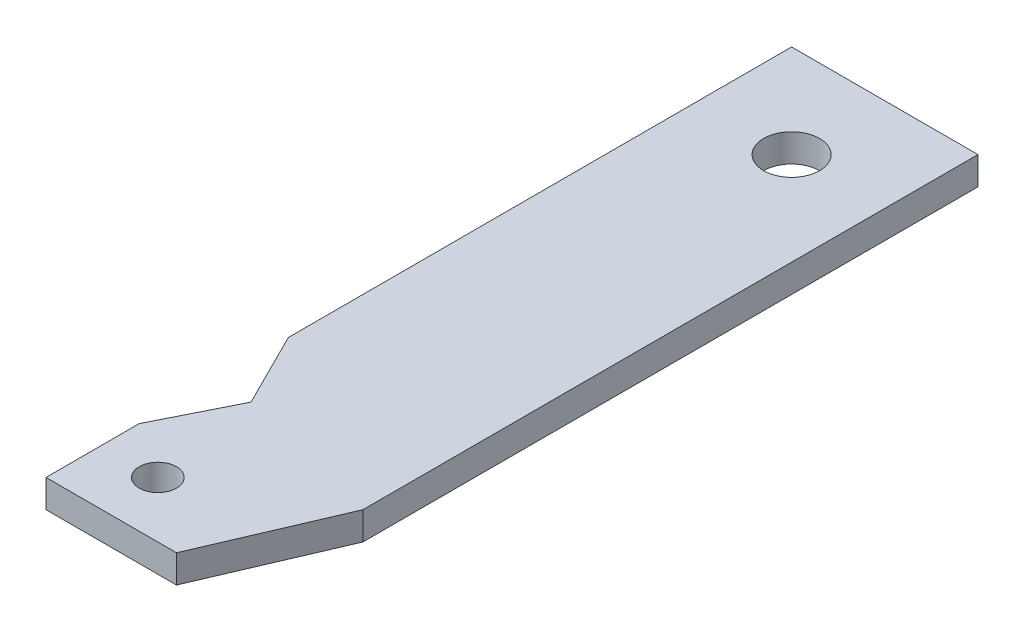
ISO-10303-21;
HEADER;
FILE_DESCRIPTION(('STEP AP214'),'2;1');
FILE_NAME('part.step','',(''),(''),'','','');
FILE_SCHEMA(('AUTOMOTIVE_DESIGN { 1 0 10303 214 1 1 1 1 }'));
ENDSEC;
DATA;
#1=APPLICATION_CONTEXT('core data for automotive mechanical design processes');
#2=APPLICATION_PROTOCOL_DEFINITION('international standard','automotive_design',2000,#1);
#3=PRODUCT_CONTEXT('',#1,'mechanical');
#4=PRODUCT('Part','Part','',(#3));
#5=PRODUCT_RELATED_PRODUCT_CATEGORY('part','',(#4));
#6=PRODUCT_DEFINITION_FORMATION('','',#4);
#7=PRODUCT_DEFINITION_CONTEXT('part definition',#1,'design');
#8=PRODUCT_DEFINITION('design','',#6,#7);
#9=PRODUCT_DEFINITION_SHAPE('','',#8);
#10=(LENGTH_UNIT() NAMED_UNIT(*) SI_UNIT(.MILLI.,.METRE.));
#11=(NAMED_UNIT(*) PLANE_ANGLE_UNIT() SI_UNIT($,.RADIAN.));
#12=(NAMED_UNIT(*) SI_UNIT($,.STERADIAN.) SOLID_ANGLE_UNIT());
#13=UNCERTAINTY_MEASURE_WITH_UNIT(LENGTH_MEASURE(1.E-05),#10,'distance_accuracy_value','');
#14=(GEOMETRIC_REPRESENTATION_CONTEXT(3) GLOBAL_UNCERTAINTY_ASSIGNED_CONTEXT((#13)) GLOBAL_UNIT_ASSIGNED_CONTEXT((#10,
#11,#12)) REPRESENTATION_CONTEXT('',''));
#15=CARTESIAN_POINT('',(0.,0.,0.));
#16=DIRECTION('',(0.,0.,1.));
#17=DIRECTION('',(1.,0.,0.));
#18=AXIS2_PLACEMENT_3D('',#15,#16,#17);
#19=CARTESIAN_POINT('',(-12.7725811166779,11.5904210526316,40.));
#20=DIRECTION('',(1.,0.,0.));
#21=DIRECTION('',(0.,1.,0.));
#22=AXIS2_PLACEMENT_3D('',#19,#20,#21);
#23=PLANE('',#22);
#24=DIRECTION('',(0.,0.,-1.));
#25=VECTOR('',#24,1.);
#26=CARTESIAN_POINT('',(-12.7725811166779,10.0904210526316,40.));
#27=LINE('',#26,#25);
#28=CARTESIAN_POINT('',(-12.7725811166779,10.0904210526316,27.));
#29=VERTEX_POINT('',#28);
#30=CARTESIAN_POINT('',(-12.7725811166779,10.0904210526316,0.));
#31=VERTEX_POINT('',#30);
#32=EDGE_CURVE('E117',#29,#31,#27,.T.);
#33=ORIENTED_EDGE('',*,*,#32,.F.);
#34=DIRECTION('',(0.,1.,0.));
#35=VECTOR('',#34,1.);
#36=CARTESIAN_POINT('',(-12.7725811166779,-38.4095789473684,27.));
#37=LINE('',#36,#35);
#38=CARTESIAN_POINT('',(-12.7725811166779,11.5904210526316,27.));
#39=VERTEX_POINT('',#38);
#40=EDGE_CURVE('E171',#29,#39,#37,.T.);
#41=ORIENTED_EDGE('',*,*,#40,.T.);
#42=DIRECTION('',(0.,0.,-1.));
#43=VECTOR('',#42,1.);
#44=CARTESIAN_POINT('',(-12.7725811166779,11.5904210526316,40.));
#45=LINE('',#44,#43);
#46=CARTESIAN_POINT('',(-12.7725811166779,11.5904210526316,0.));
#47=VERTEX_POINT('',#46);
#48=EDGE_CURVE('E120',#39,#47,#45,.T.);
#49=ORIENTED_EDGE('',*,*,#48,.T.);
#50=DIRECTION('',(0.,-1.,0.));
#51=VECTOR('',#50,1.);
#52=CARTESIAN_POINT('',(-12.7725811166779,11.5904210526316,0.));
#53=LINE('',#52,#51);
#54=EDGE_CURVE('E140',#47,#31,#53,.T.);
#55=ORIENTED_EDGE('',*,*,#54,.T.);
#56=EDGE_LOOP('',(#33,#41,#49,#55));
#57=FACE_BOUND('',#56,.T.);
#58=ADVANCED_FACE('F30',(#57),#23,.F.);
#59=CARTESIAN_POINT('',(-12.7725811166779,11.5904210526316,40.));
#60=VERTEX_POINT('',#59);
#61=CARTESIAN_POINT('',(-12.7725811166779,11.5904210526316,35.));
#62=VERTEX_POINT('',#61);
#63=EDGE_CURVE('E115',#60,#62,#45,.T.);
#64=ORIENTED_EDGE('',*,*,#63,.T.);
#65=DIRECTION('',(0.,1.,0.));
#66=VECTOR('',#65,1.);
#67=CARTESIAN_POINT('',(-12.7725811166779,-38.4095789473684,35.));
#68=LINE('',#67,#66);
#69=CARTESIAN_POINT('',(-12.7725811166779,10.0904210526316,35.));
#70=VERTEX_POINT('',#69);
#71=EDGE_CURVE('E52',#70,#62,#68,.T.);
#72=ORIENTED_EDGE('',*,*,#71,.F.);
#73=CARTESIAN_POINT('',(-12.7725811166779,10.0904210526316,40.));
#74=VERTEX_POINT('',#73);
#75=EDGE_CURVE('E38',#74,#70,#27,.T.);
#76=ORIENTED_EDGE('',*,*,#75,.F.);
#77=DIRECTION('',(0.,-1.,0.));
#78=VECTOR('',#77,1.);
#79=CARTESIAN_POINT('',(-12.7725811166779,11.5904210526316,40.));
#80=LINE('',#79,#78);
#81=EDGE_CURVE('E152',#60,#74,#80,.T.);
#82=ORIENTED_EDGE('',*,*,#81,.F.);
#83=EDGE_LOOP('',(#64,#72,#76,#82));
#84=FACE_BOUND('',#83,.T.);
#85=ADVANCED_FACE('F32',(#84),#23,.F.);
#86=CARTESIAN_POINT('',(-12.7725811166779,10.0904210526316,40.));
#87=DIRECTION('',(0.,1.,0.));
#88=DIRECTION('',(0.,0.,1.));
#89=AXIS2_PLACEMENT_3D('',#86,#87,#88);
#90=PLANE('',#89);
#91=CARTESIAN_POINT('',(-7.77258111667787,10.0904210526316,5.));
#92=DIRECTION('',(0.,1.,0.));
#93=DIRECTION('',(0.,0.,1.));
#94=AXIS2_PLACEMENT_3D('',#91,#92,#93);
#95=CIRCLE('',#94,1.5);
#96=CARTESIAN_POINT('',(-7.77258111667787,10.0904210526316,6.5));
#97=VERTEX_POINT('',#96);
#98=EDGE_CURVE('E162',#97,#97,#95,.T.);
#99=ORIENTED_EDGE('',*,*,#98,.T.);
#100=EDGE_LOOP('',(#99));
#101=FACE_BOUND('',#100,.T.);
#102=CARTESIAN_POINT('',(-9.77258111667787,10.0904210526316,37.));
#103=DIRECTION('',(0.,1.,0.));
#104=DIRECTION('',(0.,0.,1.));
#105=AXIS2_PLACEMENT_3D('',#102,#103,#104);
#106=CIRCLE('',#105,1.);
#107=CARTESIAN_POINT('',(-9.77258111667787,10.0904210526316,38.));
#108=VERTEX_POINT('',#107);
#109=EDGE_CURVE('E143',#108,#108,#106,.T.);
#110=ORIENTED_EDGE('',*,*,#109,.T.);
#111=EDGE_LOOP('',(#110));
#112=FACE_BOUND('',#111,.T.);
#113=DIRECTION('',(0.,0.,-1.));
#114=VECTOR('',#113,1.);
#115=CARTESIAN_POINT('',(-2.77258111667787,10.0904210526316,40.));
#116=LINE('',#115,#114);
#117=CARTESIAN_POINT('',(-2.77258111667787,10.0904210526316,33.));
#118=VERTEX_POINT('',#117);
#119=CARTESIAN_POINT('',(-2.77258111667787,10.0904210526316,0.));
#120=VERTEX_POINT('',#119);
#121=EDGE_CURVE('E114',#118,#120,#116,.T.);
#122=ORIENTED_EDGE('',*,*,#121,.F.);
#123=DIRECTION('',(-0.393919298579168,0.,0.919145030018058));
#124=VECTOR('',#123,1.);
#125=CARTESIAN_POINT('',(-6.85878801322959,10.0904210526316,42.5344827586207));
#126=LINE('',#125,#124);
#127=CARTESIAN_POINT('',(-5.77258111667787,10.0904210526316,40.));
#128=VERTEX_POINT('',#127);
#129=EDGE_CURVE('E96',#118,#128,#126,.T.);
#130=ORIENTED_EDGE('',*,*,#129,.T.);
#131=DIRECTION('',(1.,0.,0.));
#132=VECTOR('',#131,1.);
#133=CARTESIAN_POINT('',(-12.7725811166779,10.0904210526316,40.));
#134=LINE('',#133,#132);
#135=EDGE_CURVE('E154',#74,#128,#134,.T.);
#136=ORIENTED_EDGE('',*,*,#135,.F.);
#137=ORIENTED_EDGE('',*,*,#75,.T.);
#138=DIRECTION('',(0.447213595499958,0.,-0.894427190999916));
#139=VECTOR('',#138,1.);
#140=CARTESIAN_POINT('',(-14.7725811166779,10.0904210526316,39.));
#141=LINE('',#140,#139);
#142=CARTESIAN_POINT('',(-10.7725811166779,10.0904210526316,31.));
#143=VERTEX_POINT('',#142);
#144=EDGE_CURVE('E169',#70,#143,#141,.T.);
#145=ORIENTED_EDGE('',*,*,#144,.T.);
#146=DIRECTION('',(-0.447213595499958,0.,-0.894427190999916));
#147=VECTOR('',#146,1.);
#148=CARTESIAN_POINT('',(-7.57258111667787,10.0904210526316,37.4));
#149=LINE('',#148,#147);
#150=EDGE_CURVE('E133',#143,#29,#149,.T.);
#151=ORIENTED_EDGE('',*,*,#150,.T.);
#152=ORIENTED_EDGE('',*,*,#32,.T.);
#153=DIRECTION('',(1.,0.,0.));
#154=VECTOR('',#153,1.);
#155=CARTESIAN_POINT('',(-12.7725811166779,10.0904210526316,0.));
#156=LINE('',#155,#154);
#157=EDGE_CURVE('E132',#31,#120,#156,.T.);
#158=ORIENTED_EDGE('',*,*,#157,.T.);
#159=EDGE_LOOP('',(#122,#130,#136,#137,#145,#151,#152,#158));
#160=FACE_BOUND('',#159,.T.);
#161=ADVANCED_FACE('F131',(#101,#112,#160),#90,.F.);
#162=CARTESIAN_POINT('',(-2.77258111667787,11.5904210526316,40.));
#163=DIRECTION('',(-1.,0.,0.));
#164=DIRECTION('',(0.,-1.,0.));
#165=AXIS2_PLACEMENT_3D('',#162,#163,#164);
#166=PLANE('',#165);
#167=DIRECTION('',(0.,0.,-1.));
#168=VECTOR('',#167,1.);
#169=CARTESIAN_POINT('',(-2.77258111667787,11.5904210526316,40.));
#170=LINE('',#169,#168);
#171=CARTESIAN_POINT('',(-2.77258111667787,11.5904210526316,33.));
#172=VERTEX_POINT('',#171);
#173=CARTESIAN_POINT('',(-2.77258111667787,11.5904210526316,0.));
#174=VERTEX_POINT('',#173);
#175=EDGE_CURVE('E105',#172,#174,#170,.T.);
#176=ORIENTED_EDGE('',*,*,#175,.F.);
#177=DIRECTION('',(0.,1.,0.));
#178=VECTOR('',#177,1.);
#179=CARTESIAN_POINT('',(-2.77258111667787,-38.4095789473684,33.));
#180=LINE('',#179,#178);
#181=EDGE_CURVE('E93',#118,#172,#180,.T.);
#182=ORIENTED_EDGE('',*,*,#181,.F.);
#183=ORIENTED_EDGE('',*,*,#121,.T.);
#184=DIRECTION('',(0.,1.,0.));
#185=VECTOR('',#184,1.);
#186=CARTESIAN_POINT('',(-2.77258111667787,11.5904210526316,0.));
#187=LINE('',#186,#185);
#188=EDGE_CURVE('E112',#120,#174,#187,.T.);
#189=ORIENTED_EDGE('',*,*,#188,.T.);
#190=EDGE_LOOP('',(#176,#182,#183,#189));
#191=FACE_BOUND('',#190,.T.);
#192=ADVANCED_FACE('F110',(#191),#166,.F.);
#193=CARTESIAN_POINT('',(-12.7725811166779,11.5904210526316,40.));
#194=DIRECTION('',(0.,-1.,0.));
#195=DIRECTION('',(0.,0.,-1.));
#196=AXIS2_PLACEMENT_3D('',#193,#194,#195);
#197=PLANE('',#196);
#198=CARTESIAN_POINT('',(-7.77258111667787,11.5904210526316,5.));
#199=DIRECTION('',(0.,1.,0.));
#200=DIRECTION('',(0.,0.,1.));
#201=AXIS2_PLACEMENT_3D('',#198,#199,#200);
#202=CIRCLE('',#201,1.5);
#203=CARTESIAN_POINT('',(-7.77258111667787,11.5904210526316,6.5));
#204=VERTEX_POINT('',#203);
#205=EDGE_CURVE('E165',#204,#204,#202,.T.);
#206=ORIENTED_EDGE('',*,*,#205,.F.);
#207=EDGE_LOOP('',(#206));
#208=FACE_BOUND('',#207,.T.);
#209=CARTESIAN_POINT('',(-9.77258111667787,11.5904210526316,37.));
#210=DIRECTION('',(0.,1.,0.));
#211=DIRECTION('',(0.,0.,1.));
#212=AXIS2_PLACEMENT_3D('',#209,#210,#211);
#213=CIRCLE('',#212,1.);
#214=CARTESIAN_POINT('',(-9.77258111667787,11.5904210526316,38.));
#215=VERTEX_POINT('',#214);
#216=EDGE_CURVE('E146',#215,#215,#213,.T.);
#217=ORIENTED_EDGE('',*,*,#216,.F.);
#218=EDGE_LOOP('',(#217));
#219=FACE_BOUND('',#218,.T.);
#220=DIRECTION('',(-1.,0.,0.));
#221=VECTOR('',#220,1.);
#222=CARTESIAN_POINT('',(-12.7725811166779,11.5904210526316,40.));
#223=LINE('',#222,#221);
#224=CARTESIAN_POINT('',(-5.77258111667787,11.5904210526316,40.));
#225=VERTEX_POINT('',#224);
#226=EDGE_CURVE('E108',#225,#60,#223,.T.);
#227=ORIENTED_EDGE('',*,*,#226,.F.);
#228=DIRECTION('',(-0.393919298579168,0.,0.919145030018058));
#229=VECTOR('',#228,1.);
#230=CARTESIAN_POINT('',(-2.77258111667787,11.5904210526316,33.));
#231=LINE('',#230,#229);
#232=EDGE_CURVE('E44',#172,#225,#231,.T.);
#233=ORIENTED_EDGE('',*,*,#232,.F.);
#234=ORIENTED_EDGE('',*,*,#175,.T.);
#235=DIRECTION('',(-1.,0.,0.));
#236=VECTOR('',#235,1.);
#237=CARTESIAN_POINT('',(-12.7725811166779,11.5904210526316,0.));
#238=LINE('',#237,#236);
#239=EDGE_CURVE('E151',#174,#47,#238,.T.);
#240=ORIENTED_EDGE('',*,*,#239,.T.);
#241=ORIENTED_EDGE('',*,*,#48,.F.);
#242=DIRECTION('',(-0.447213595499958,0.,-0.894427190999916));
#243=VECTOR('',#242,1.);
#244=CARTESIAN_POINT('',(-10.7725811166779,11.5904210526316,31.));
#245=LINE('',#244,#243);
#246=CARTESIAN_POINT('',(-10.7725811166779,11.5904210526316,31.));
#247=VERTEX_POINT('',#246);
#248=EDGE_CURVE('E174',#247,#39,#245,.T.);
#249=ORIENTED_EDGE('',*,*,#248,.F.);
#250=DIRECTION('',(0.447213595499958,0.,-0.894427190999916));
#251=VECTOR('',#250,1.);
#252=CARTESIAN_POINT('',(-12.7725811166779,11.5904210526316,35.));
#253=LINE('',#252,#251);
#254=EDGE_CURVE('E178',#62,#247,#253,.T.);
#255=ORIENTED_EDGE('',*,*,#254,.F.);
#256=ORIENTED_EDGE('',*,*,#63,.F.);
#257=EDGE_LOOP('',(#227,#233,#234,#240,#241,#249,#255,#256));
#258=FACE_BOUND('',#257,.T.);
#259=ADVANCED_FACE('F103',(#208,#219,#258),#197,.F.);
#260=CARTESIAN_POINT('',(-12.7725811166779,10.0904210526316,40.));
#261=DIRECTION('',(0.,0.,1.));
#262=DIRECTION('',(1.,0.,0.));
#263=AXIS2_PLACEMENT_3D('',#260,#261,#262);
#264=PLANE('',#263);
#265=DIRECTION('',(0.,-1.,0.));
#266=VECTOR('',#265,1.);
#267=CARTESIAN_POINT('',(-5.77258111667787,10.0904210526316,40.));
#268=LINE('',#267,#266);
#269=EDGE_CURVE('E11',#225,#128,#268,.T.);
#270=ORIENTED_EDGE('',*,*,#269,.F.);
#271=ORIENTED_EDGE('',*,*,#226,.T.);
#272=ORIENTED_EDGE('',*,*,#81,.T.);
#273=ORIENTED_EDGE('',*,*,#135,.T.);
#274=EDGE_LOOP('',(#270,#271,#272,#273));
#275=FACE_BOUND('',#274,.T.);
#276=ADVANCED_FACE('F180',(#275),#264,.T.);
#277=CARTESIAN_POINT('',(-12.7725811166779,10.0904210526316,0.));
#278=DIRECTION('',(0.,0.,1.));
#279=DIRECTION('',(1.,0.,0.));
#280=AXIS2_PLACEMENT_3D('',#277,#278,#279);
#281=PLANE('',#280);
#282=ORIENTED_EDGE('',*,*,#54,.F.);
#283=ORIENTED_EDGE('',*,*,#239,.F.);
#284=ORIENTED_EDGE('',*,*,#188,.F.);
#285=ORIENTED_EDGE('',*,*,#157,.F.);
#286=EDGE_LOOP('',(#282,#283,#284,#285));
#287=FACE_BOUND('',#286,.T.);
#288=ADVANCED_FACE('F139',(#287),#281,.F.);
#289=CARTESIAN_POINT('',(-9.77258111667787,-38.4095789473684,37.));
#290=DIRECTION('',(0.,1.,0.));
#291=DIRECTION('',(0.,0.,1.));
#292=AXIS2_PLACEMENT_3D('',#289,#290,#291);
#293=CYLINDRICAL_SURFACE('',#292,1.);
#294=ORIENTED_EDGE('',*,*,#216,.T.);
#295=EDGE_LOOP('',(#294));
#296=FACE_BOUND('',#295,.T.);
#297=ORIENTED_EDGE('',*,*,#109,.F.);
#298=EDGE_LOOP('',(#297));
#299=FACE_BOUND('',#298,.T.);
#300=ADVANCED_FACE('F236',(#296,#299),#293,.F.);
#301=CARTESIAN_POINT('',(-7.77258111667787,-38.4095789473684,5.));
#302=DIRECTION('',(0.,1.,0.));
#303=DIRECTION('',(0.,0.,1.));
#304=AXIS2_PLACEMENT_3D('',#301,#302,#303);
#305=CYLINDRICAL_SURFACE('',#304,1.5);
#306=ORIENTED_EDGE('',*,*,#205,.T.);
#307=EDGE_LOOP('',(#306));
#308=FACE_BOUND('',#307,.T.);
#309=ORIENTED_EDGE('',*,*,#98,.F.);
#310=EDGE_LOOP('',(#309));
#311=FACE_BOUND('',#310,.T.);
#312=ADVANCED_FACE('F240',(#308,#311),#305,.F.);
#313=CARTESIAN_POINT('',(-10.7725811166779,-38.4095789473684,31.));
#314=DIRECTION('',(0.894427190999916,0.,-0.447213595499958));
#315=DIRECTION('',(-0.447213595499958,0.,-0.894427190999916));
#316=AXIS2_PLACEMENT_3D('',#313,#314,#315);
#317=PLANE('',#316);
#318=DIRECTION('',(0.,1.,0.));
#319=VECTOR('',#318,1.);
#320=CARTESIAN_POINT('',(-10.7725811166779,-38.4095789473684,31.));
#321=LINE('',#320,#319);
#322=EDGE_CURVE('E173',#143,#247,#321,.T.);
#323=ORIENTED_EDGE('',*,*,#322,.T.);
#324=ORIENTED_EDGE('',*,*,#248,.T.);
#325=ORIENTED_EDGE('',*,*,#40,.F.);
#326=ORIENTED_EDGE('',*,*,#150,.F.);
#327=EDGE_LOOP('',(#323,#324,#325,#326));
#328=FACE_BOUND('',#327,.T.);
#329=ADVANCED_FACE('F250',(#328),#317,.F.);
#330=CARTESIAN_POINT('',(-12.7725811166779,-38.4095789473684,35.));
#331=DIRECTION('',(0.894427190999916,0.,0.447213595499958));
#332=DIRECTION('',(0.447213595499958,0.,-0.894427190999916));
#333=AXIS2_PLACEMENT_3D('',#330,#331,#332);
#334=PLANE('',#333);
#335=ORIENTED_EDGE('',*,*,#71,.T.);
#336=ORIENTED_EDGE('',*,*,#254,.T.);
#337=ORIENTED_EDGE('',*,*,#322,.F.);
#338=ORIENTED_EDGE('',*,*,#144,.F.);
#339=EDGE_LOOP('',(#335,#336,#337,#338));
#340=FACE_BOUND('',#339,.T.);
#341=ADVANCED_FACE('F260',(#340),#334,.F.);
#342=CARTESIAN_POINT('',(-2.77258111667787,-38.4095789473684,33.));
#343=DIRECTION('',(-0.919145030018058,0.,-0.393919298579168));
#344=DIRECTION('',(-0.393919298579168,0.,0.919145030018058));
#345=AXIS2_PLACEMENT_3D('',#342,#343,#344);
#346=PLANE('',#345);
#347=ORIENTED_EDGE('',*,*,#181,.T.);
#348=ORIENTED_EDGE('',*,*,#232,.T.);
#349=ORIENTED_EDGE('',*,*,#269,.T.);
#350=ORIENTED_EDGE('',*,*,#129,.F.);
#351=EDGE_LOOP('',(#347,#348,#349,#350));
#352=FACE_BOUND('',#351,.T.);
#353=ADVANCED_FACE('F94',(#352),#346,.F.);
#354=CLOSED_SHELL('',(#58,#85,#161,#192,#259,#276,#288,#300,#312,#329,#341,#353));
#355=MANIFOLD_SOLID_BREP('B2',#354);
#356=ADVANCED_BREP_SHAPE_REPRESENTATION('',(#18,#355),#14);
#357=SHAPE_DEFINITION_REPRESENTATION(#9,#356);
ENDSEC;
END-ISO-10303-21;
